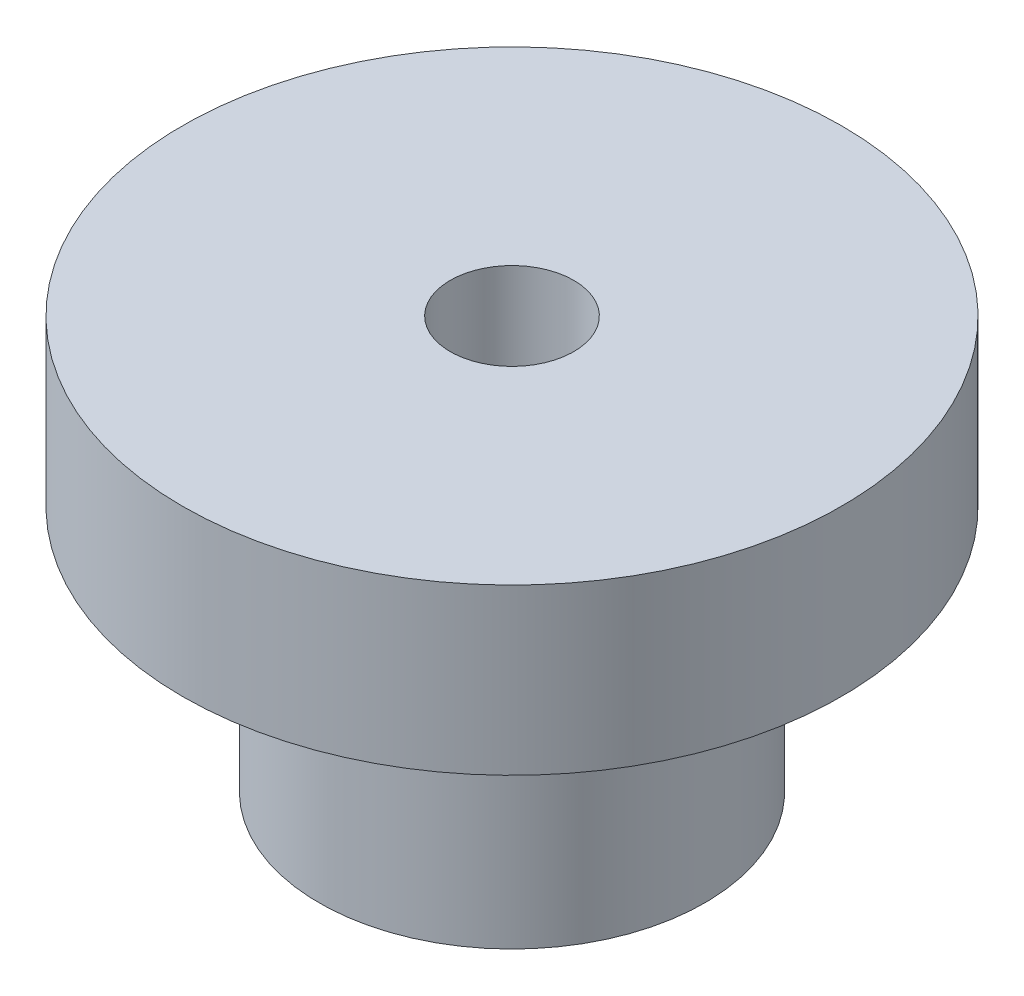
ISO-10303-21;
HEADER;
FILE_DESCRIPTION(('STEP AP214'),'2;1');
FILE_NAME('part.step','',(''),(''),'','','');
FILE_SCHEMA(('AUTOMOTIVE_DESIGN { 1 0 10303 214 1 1 1 1 }'));
ENDSEC;
DATA;
#1=APPLICATION_CONTEXT('core data for automotive mechanical design processes');
#2=APPLICATION_PROTOCOL_DEFINITION('international standard','automotive_design',2000,#1);
#3=PRODUCT_CONTEXT('',#1,'mechanical');
#4=PRODUCT('Part','Part','',(#3));
#5=PRODUCT_RELATED_PRODUCT_CATEGORY('part','',(#4));
#6=PRODUCT_DEFINITION_FORMATION('','',#4);
#7=PRODUCT_DEFINITION_CONTEXT('part definition',#1,'design');
#8=PRODUCT_DEFINITION('design','',#6,#7);
#9=PRODUCT_DEFINITION_SHAPE('','',#8);
#10=(LENGTH_UNIT() NAMED_UNIT(*) SI_UNIT(.MILLI.,.METRE.));
#11=(NAMED_UNIT(*) PLANE_ANGLE_UNIT() SI_UNIT($,.RADIAN.));
#12=(NAMED_UNIT(*) SI_UNIT($,.STERADIAN.) SOLID_ANGLE_UNIT());
#13=UNCERTAINTY_MEASURE_WITH_UNIT(LENGTH_MEASURE(1.E-05),#10,'distance_accuracy_value','');
#14=(GEOMETRIC_REPRESENTATION_CONTEXT(3) GLOBAL_UNCERTAINTY_ASSIGNED_CONTEXT((#13)) GLOBAL_UNIT_ASSIGNED_CONTEXT((#10,
#11,#12)) REPRESENTATION_CONTEXT('',''));
#15=CARTESIAN_POINT('',(0.,0.,0.));
#16=DIRECTION('',(0.,0.,1.));
#17=DIRECTION('',(1.,0.,0.));
#18=AXIS2_PLACEMENT_3D('',#15,#16,#17);
#19=CARTESIAN_POINT('',(-27.1992051574368,0.,0.));
#20=DIRECTION('',(0.,1.,0.));
#21=DIRECTION('',(0.,0.,1.));
#22=AXIS2_PLACEMENT_3D('',#19,#20,#21);
#23=PLANE('',#22);
#24=CARTESIAN_POINT('',(-27.1992051574368,0.,0.));
#25=DIRECTION('',(0.,1.,0.));
#26=DIRECTION('',(0.,0.,1.));
#27=AXIS2_PLACEMENT_3D('',#24,#25,#26);
#28=CIRCLE('',#27,3.71475);
#29=CARTESIAN_POINT('',(-27.1992051574368,0.,-3.71475));
#30=VERTEX_POINT('',#29);
#31=EDGE_CURVE('E38',#30,#30,#28,.T.);
#32=ORIENTED_EDGE('',*,*,#31,.F.);
#33=EDGE_LOOP('',(#32));
#34=FACE_BOUND('',#33,.T.);
#35=CARTESIAN_POINT('',(-27.1992051574368,0.,0.));
#36=DIRECTION('',(0.,1.,0.));
#37=DIRECTION('',(0.,0.,1.));
#38=AXIS2_PLACEMENT_3D('',#35,#36,#37);
#39=CIRCLE('',#38,1.190625);
#40=CARTESIAN_POINT('',(-27.1992051574368,0.,-1.190625));
#41=VERTEX_POINT('',#40);
#42=EDGE_CURVE('E45',#41,#41,#39,.T.);
#43=ORIENTED_EDGE('',*,*,#42,.T.);
#44=EDGE_LOOP('',(#43));
#45=FACE_BOUND('',#44,.T.);
#46=ADVANCED_FACE('F34',(#34,#45),#23,.F.);
#47=CARTESIAN_POINT('',(-27.1992051574368,4.7625,0.));
#48=DIRECTION('',(0.,-1.,0.));
#49=DIRECTION('',(0.,0.,-1.));
#50=AXIS2_PLACEMENT_3D('',#47,#48,#49);
#51=CYLINDRICAL_SURFACE('',#50,3.71475);
#52=CARTESIAN_POINT('',(-27.1992051574368,4.7625,0.));
#53=DIRECTION('',(0.,1.,0.));
#54=DIRECTION('',(0.,0.,1.));
#55=AXIS2_PLACEMENT_3D('',#52,#53,#54);
#56=CIRCLE('',#55,3.71475);
#57=CARTESIAN_POINT('',(-27.1992051574368,4.7625,-3.71475));
#58=VERTEX_POINT('',#57);
#59=EDGE_CURVE('E10',#58,#58,#56,.T.);
#60=CARTESIAN_POINT('',(-27.1992051574368,4.7625,-3.71475));
#61=CARTESIAN_POINT('',(-27.1992051574368,4.712890625,-3.71475));
#62=CARTESIAN_POINT('',(-27.1992051574368,4.66328125,-3.71475));
#63=CARTESIAN_POINT('',(-27.1992051574368,4.5640625,-3.71475));
#64=CARTESIAN_POINT('',(-27.1992051574368,4.514453125,-3.71475));
#65=CARTESIAN_POINT('',(-27.1992051574368,4.415234375,-3.71475));
#66=CARTESIAN_POINT('',(-27.1992051574368,4.365625,-3.71475));
#67=CARTESIAN_POINT('',(-27.1992051574368,4.26640625,-3.71475));
#68=CARTESIAN_POINT('',(-27.1992051574368,4.216796875,-3.71475));
#69=CARTESIAN_POINT('',(-27.1992051574368,4.117578125,-3.71475));
#70=CARTESIAN_POINT('',(-27.1992051574368,4.06796875,-3.71475));
#71=CARTESIAN_POINT('',(-27.1992051574368,3.96875,-3.71475));
#72=CARTESIAN_POINT('',(-27.1992051574368,3.919140625,-3.71475));
#73=CARTESIAN_POINT('',(-27.1992051574368,3.819921875,-3.71475));
#74=CARTESIAN_POINT('',(-27.1992051574368,3.7703125,-3.71475));
#75=CARTESIAN_POINT('',(-27.1992051574368,3.67109375,-3.71475));
#76=CARTESIAN_POINT('',(-27.1992051574368,3.621484375,-3.71475));
#77=CARTESIAN_POINT('',(-27.1992051574368,3.522265625,-3.71475));
#78=CARTESIAN_POINT('',(-27.1992051574368,3.47265625,-3.71475));
#79=CARTESIAN_POINT('',(-27.1992051574368,3.3734375,-3.71475));
#80=CARTESIAN_POINT('',(-27.1992051574368,3.323828125,-3.71475));
#81=CARTESIAN_POINT('',(-27.1992051574368,3.224609375,-3.71475));
#82=CARTESIAN_POINT('',(-27.1992051574368,3.175,-3.71475));
#83=CARTESIAN_POINT('',(-27.1992051574368,3.07578125,-3.71475));
#84=CARTESIAN_POINT('',(-27.1992051574368,3.026171875,-3.71475));
#85=CARTESIAN_POINT('',(-27.1992051574368,2.926953125,-3.71475));
#86=CARTESIAN_POINT('',(-27.1992051574368,2.87734375,-3.71475));
#87=CARTESIAN_POINT('',(-27.1992051574368,2.778125,-3.71475));
#88=CARTESIAN_POINT('',(-27.1992051574368,2.728515625,-3.71475));
#89=CARTESIAN_POINT('',(-27.1992051574368,2.629296875,-3.71475));
#90=CARTESIAN_POINT('',(-27.1992051574368,2.5796875,-3.71475));
#91=CARTESIAN_POINT('',(-27.1992051574368,2.48046875,-3.71475));
#92=CARTESIAN_POINT('',(-27.1992051574368,2.430859375,-3.71475));
#93=CARTESIAN_POINT('',(-27.1992051574368,2.331640625,-3.71475));
#94=CARTESIAN_POINT('',(-27.1992051574368,2.28203125,-3.71475));
#95=CARTESIAN_POINT('',(-27.1992051574368,2.1828125,-3.71475));
#96=CARTESIAN_POINT('',(-27.1992051574368,2.133203125,-3.71475));
#97=CARTESIAN_POINT('',(-27.1992051574368,2.033984375,-3.71475));
#98=CARTESIAN_POINT('',(-27.1992051574368,1.984375,-3.71475));
#99=CARTESIAN_POINT('',(-27.1992051574368,1.88515625,-3.71475));
#100=CARTESIAN_POINT('',(-27.1992051574368,1.835546875,-3.71475));
#101=CARTESIAN_POINT('',(-27.1992051574368,1.736328125,-3.71475));
#102=CARTESIAN_POINT('',(-27.1992051574368,1.68671875,-3.71475));
#103=CARTESIAN_POINT('',(-27.1992051574368,1.5875,-3.71475));
#104=CARTESIAN_POINT('',(-27.1992051574368,1.537890625,-3.71475));
#105=CARTESIAN_POINT('',(-27.1992051574368,1.438671875,-3.71475));
#106=CARTESIAN_POINT('',(-27.1992051574368,1.3890625,-3.71475));
#107=CARTESIAN_POINT('',(-27.1992051574368,1.28984375,-3.71475));
#108=CARTESIAN_POINT('',(-27.1992051574368,1.240234375,-3.71475));
#109=CARTESIAN_POINT('',(-27.1992051574368,1.141015625,-3.71475));
#110=CARTESIAN_POINT('',(-27.1992051574368,1.09140625,-3.71475));
#111=CARTESIAN_POINT('',(-27.1992051574368,0.9921875,-3.71475));
#112=CARTESIAN_POINT('',(-27.1992051574368,0.942578125,-3.71475));
#113=CARTESIAN_POINT('',(-27.1992051574368,0.843359375,-3.71475));
#114=CARTESIAN_POINT('',(-27.1992051574368,0.79375,-3.71475));
#115=CARTESIAN_POINT('',(-27.1992051574368,0.69453125,-3.71475));
#116=CARTESIAN_POINT('',(-27.1992051574368,0.644921875,-3.71475));
#117=CARTESIAN_POINT('',(-27.1992051574368,0.545703125,-3.71475));
#118=CARTESIAN_POINT('',(-27.1992051574368,0.49609375,-3.71475));
#119=CARTESIAN_POINT('',(-27.1992051574368,0.396875,-3.71475));
#120=CARTESIAN_POINT('',(-27.1992051574368,0.347265625,-3.71475));
#121=CARTESIAN_POINT('',(-27.1992051574368,0.248046875,-3.71475));
#122=CARTESIAN_POINT('',(-27.1992051574368,0.1984375,-3.71475));
#123=CARTESIAN_POINT('',(-27.1992051574368,0.09921875,-3.71475));
#124=CARTESIAN_POINT('',(-27.1992051574368,0.049609375,-3.71475));
#125=CARTESIAN_POINT('',(-27.1992051574368,0.,-3.71475));
#126=B_SPLINE_CURVE_WITH_KNOTS('',3,(#60,#61,#62,#63,#64,#65,#66,#67,#68,#69,#70,#71,#72,#73,
#74,#75,#76,#77,#78,#79,#80,#81,#82,#83,#84,#85,#86,#87,#88,#89,#90,#91,#92,#93,#94,#95,#96,#97,
#98,#99,#100,#101,#102,#103,#104,#105,#106,#107,#108,#109,#110,#111,#112,#113,#114,#115,#116,
#117,#118,#119,#120,#121,#122,#123,#124,#125),.UNSPECIFIED.,.F.,.F.,(4,2,2,2,2,2,2,2,2,2,2,2,2,
2,2,2,2,2,2,2,2,2,2,2,2,2,2,2,2,2,2,2,4),(0.,0.148828124999999,0.297656249999999,
0.446484374999999,0.595312499999999,0.744140625,0.89296875,1.041796875,1.190625,1.339453125,
1.48828125,1.637109375,1.7859375,1.934765625,2.08359375,2.232421875,2.38125,2.530078125,
2.67890625,2.827734375,2.9765625,3.125390625,3.27421875,3.423046875,3.571875,3.720703125,
3.86953125,4.018359375,4.1671875,4.316015625,4.46484375,4.613671875,4.7625),.UNSPECIFIED.);
#127=EDGE_CURVE('BSEAM36',#58,#30,#126,.T.);
#128=ORIENTED_EDGE('',*,*,#59,.F.);
#129=ORIENTED_EDGE('',*,*,#31,.T.);
#130=ORIENTED_EDGE('',*,*,#127,.T.);
#131=ORIENTED_EDGE('',*,*,#127,.F.);
#132=EDGE_LOOP('',(#128,#130,#129,#131));
#133=FACE_BOUND('',#132,.T.);
#134=ADVANCED_FACE('F36',(#133),#51,.T.);
#135=CARTESIAN_POINT('',(-27.1992051574368,4.7625,0.));
#136=DIRECTION('',(0.,-1.,0.));
#137=DIRECTION('',(0.,0.,-1.));
#138=AXIS2_PLACEMENT_3D('',#135,#136,#137);
#139=CYLINDRICAL_SURFACE('',#138,1.190625);
#140=CARTESIAN_POINT('',(-27.1992051574368,7.9375,0.));
#141=DIRECTION('',(0.,1.,0.));
#142=DIRECTION('',(0.,0.,1.));
#143=AXIS2_PLACEMENT_3D('',#140,#141,#142);
#144=CIRCLE('',#143,1.190625);
#145=CARTESIAN_POINT('',(-27.1992051574368,7.9375,-1.190625));
#146=VERTEX_POINT('',#145);
#147=EDGE_CURVE('E53',#146,#146,#144,.T.);
#148=CARTESIAN_POINT('',(-27.1992051574368,0.,-1.190625));
#149=CARTESIAN_POINT('',(-27.1992051574368,0.0826822916666666,-1.190625));
#150=CARTESIAN_POINT('',(-27.1992051574368,0.165364583333333,-1.190625));
#151=CARTESIAN_POINT('',(-27.1992051574368,0.330729166666666,-1.190625));
#152=CARTESIAN_POINT('',(-27.1992051574368,0.413411458333333,-1.190625));
#153=CARTESIAN_POINT('',(-27.1992051574368,0.578776041666667,-1.190625));
#154=CARTESIAN_POINT('',(-27.1992051574368,0.661458333333334,-1.190625));
#155=CARTESIAN_POINT('',(-27.1992051574368,0.826822916666667,-1.190625));
#156=CARTESIAN_POINT('',(-27.1992051574368,0.909505208333333,-1.190625));
#157=CARTESIAN_POINT('',(-27.1992051574368,1.07486979166667,-1.190625));
#158=CARTESIAN_POINT('',(-27.1992051574368,1.15755208333333,-1.190625));
#159=CARTESIAN_POINT('',(-27.1992051574368,1.32291666666667,-1.190625));
#160=CARTESIAN_POINT('',(-27.1992051574368,1.40559895833333,-1.190625));
#161=CARTESIAN_POINT('',(-27.1992051574368,1.57096354166667,-1.190625));
#162=CARTESIAN_POINT('',(-27.1992051574368,1.65364583333333,-1.190625));
#163=CARTESIAN_POINT('',(-27.1992051574368,1.81901041666667,-1.190625));
#164=CARTESIAN_POINT('',(-27.1992051574368,1.90169270833333,-1.190625));
#165=CARTESIAN_POINT('',(-27.1992051574368,2.06705729166667,-1.190625));
#166=CARTESIAN_POINT('',(-27.1992051574368,2.14973958333333,-1.190625));
#167=CARTESIAN_POINT('',(-27.1992051574368,2.31510416666667,-1.190625));
#168=CARTESIAN_POINT('',(-27.1992051574368,2.39778645833333,-1.190625));
#169=CARTESIAN_POINT('',(-27.1992051574368,2.56315104166667,-1.190625));
#170=CARTESIAN_POINT('',(-27.1992051574368,2.64583333333333,-1.190625));
#171=CARTESIAN_POINT('',(-27.1992051574368,2.81119791666667,-1.190625));
#172=CARTESIAN_POINT('',(-27.1992051574368,2.89388020833333,-1.190625));
#173=CARTESIAN_POINT('',(-27.1992051574368,3.05924479166667,-1.190625));
#174=CARTESIAN_POINT('',(-27.1992051574368,3.14192708333333,-1.190625));
#175=CARTESIAN_POINT('',(-27.1992051574368,3.30729166666667,-1.190625));
#176=CARTESIAN_POINT('',(-27.1992051574368,3.38997395833333,-1.190625));
#177=CARTESIAN_POINT('',(-27.1992051574368,3.55533854166667,-1.190625));
#178=CARTESIAN_POINT('',(-27.1992051574368,3.63802083333333,-1.190625));
#179=CARTESIAN_POINT('',(-27.1992051574368,3.80338541666667,-1.190625));
#180=CARTESIAN_POINT('',(-27.1992051574368,3.88606770833333,-1.190625));
#181=CARTESIAN_POINT('',(-27.1992051574368,4.05143229166667,-1.190625));
#182=CARTESIAN_POINT('',(-27.1992051574368,4.13411458333333,-1.190625));
#183=CARTESIAN_POINT('',(-27.1992051574368,4.29947916666667,-1.190625));
#184=CARTESIAN_POINT('',(-27.1992051574368,4.38216145833333,-1.190625));
#185=CARTESIAN_POINT('',(-27.1992051574368,4.54752604166667,-1.190625));
#186=CARTESIAN_POINT('',(-27.1992051574368,4.63020833333333,-1.190625));
#187=CARTESIAN_POINT('',(-27.1992051574368,4.79557291666667,-1.190625));
#188=CARTESIAN_POINT('',(-27.1992051574368,4.87825520833333,-1.190625));
#189=CARTESIAN_POINT('',(-27.1992051574368,5.04361979166667,-1.190625));
#190=CARTESIAN_POINT('',(-27.1992051574368,5.12630208333333,-1.190625));
#191=CARTESIAN_POINT('',(-27.1992051574368,5.29166666666667,-1.190625));
#192=CARTESIAN_POINT('',(-27.1992051574368,5.37434895833333,-1.190625));
#193=CARTESIAN_POINT('',(-27.1992051574368,5.53971354166667,-1.190625));
#194=CARTESIAN_POINT('',(-27.1992051574368,5.62239583333333,-1.190625));
#195=CARTESIAN_POINT('',(-27.1992051574368,5.78776041666667,-1.190625));
#196=CARTESIAN_POINT('',(-27.1992051574368,5.87044270833333,-1.190625));
#197=CARTESIAN_POINT('',(-27.1992051574368,6.03580729166667,-1.190625));
#198=CARTESIAN_POINT('',(-27.1992051574368,6.11848958333333,-1.190625));
#199=CARTESIAN_POINT('',(-27.1992051574368,6.28385416666667,-1.190625));
#200=CARTESIAN_POINT('',(-27.1992051574368,6.36653645833333,-1.190625));
#201=CARTESIAN_POINT('',(-27.1992051574368,6.53190104166667,-1.190625));
#202=CARTESIAN_POINT('',(-27.1992051574368,6.61458333333333,-1.190625));
#203=CARTESIAN_POINT('',(-27.1992051574368,6.77994791666667,-1.190625));
#204=CARTESIAN_POINT('',(-27.1992051574368,6.86263020833333,-1.190625));
#205=CARTESIAN_POINT('',(-27.1992051574368,7.02799479166666,-1.190625));
#206=CARTESIAN_POINT('',(-27.1992051574368,7.11067708333333,-1.190625));
#207=CARTESIAN_POINT('',(-27.1992051574368,7.27604166666667,-1.190625));
#208=CARTESIAN_POINT('',(-27.1992051574368,7.35872395833333,-1.190625));
#209=CARTESIAN_POINT('',(-27.1992051574368,7.52408854166667,-1.190625));
#210=CARTESIAN_POINT('',(-27.1992051574368,7.60677083333333,-1.190625));
#211=CARTESIAN_POINT('',(-27.1992051574368,7.77213541666667,-1.190625));
#212=CARTESIAN_POINT('',(-27.1992051574368,7.85481770833333,-1.190625));
#213=CARTESIAN_POINT('',(-27.1992051574368,7.9375,-1.190625));
#214=B_SPLINE_CURVE_WITH_KNOTS('',3,(#148,#149,#150,#151,#152,#153,#154,#155,#156,#157,#158,
#159,#160,#161,#162,#163,#164,#165,#166,#167,#168,#169,#170,#171,#172,#173,#174,#175,#176,#177,
#178,#179,#180,#181,#182,#183,#184,#185,#186,#187,#188,#189,#190,#191,#192,#193,#194,#195,#196,
#197,#198,#199,#200,#201,#202,#203,#204,#205,#206,#207,#208,#209,#210,#211,#212,#213),
.UNSPECIFIED.,.F.,.F.,(4,2,2,2,2,2,2,2,2,2,2,2,2,2,2,2,2,2,2,2,2,2,2,2,2,2,2,2,2,2,2,2,4),(0.,
0.248046875,0.49609375,0.744140625,0.9921875,1.240234375,1.48828125,1.736328125,1.984375,
2.232421875,2.48046875,2.728515625,2.9765625,3.224609375,3.47265625,3.720703125,3.96875,
4.216796875,4.46484375,4.712890625,4.9609375,5.208984375,5.45703125,5.705078125,5.953125,
6.201171875,6.44921875,6.697265625,6.9453125,7.193359375,7.44140625,7.689453125,7.9375),.UNSPECIFIED.);
#215=EDGE_CURVE('BSEAM59',#41,#146,#214,.T.);
#216=ORIENTED_EDGE('',*,*,#42,.F.);
#217=ORIENTED_EDGE('',*,*,#147,.T.);
#218=ORIENTED_EDGE('',*,*,#215,.T.);
#219=ORIENTED_EDGE('',*,*,#215,.F.);
#220=EDGE_LOOP('',(#216,#218,#217,#219));
#221=FACE_BOUND('',#220,.T.);
#222=ADVANCED_FACE('F59',(#221),#139,.F.);
#223=CARTESIAN_POINT('',(-27.1992051574368,7.9375,0.));
#224=DIRECTION('',(0.,1.,0.));
#225=DIRECTION('',(0.,0.,1.));
#226=AXIS2_PLACEMENT_3D('',#223,#224,#225);
#227=PLANE('',#226);
#228=CARTESIAN_POINT('',(-27.1992051574368,7.9375,0.));
#229=DIRECTION('',(0.,1.,0.));
#230=DIRECTION('',(0.,0.,1.));
#231=AXIS2_PLACEMENT_3D('',#228,#229,#230);
#232=CIRCLE('',#231,6.35);
#233=CARTESIAN_POINT('',(-27.1992051574368,7.9375,6.35));
#234=VERTEX_POINT('',#233);
#235=EDGE_CURVE('E49',#234,#234,#232,.T.);
#236=ORIENTED_EDGE('',*,*,#235,.T.);
#237=EDGE_LOOP('',(#236));
#238=FACE_BOUND('',#237,.T.);
#239=ORIENTED_EDGE('',*,*,#147,.F.);
#240=EDGE_LOOP('',(#239));
#241=FACE_BOUND('',#240,.T.);
#242=ADVANCED_FACE('F61',(#238,#241),#227,.T.);
#243=CARTESIAN_POINT('',(-27.1992051574368,4.7625,0.));
#244=DIRECTION('',(0.,1.,0.));
#245=DIRECTION('',(0.,0.,1.));
#246=AXIS2_PLACEMENT_3D('',#243,#244,#245);
#247=PLANE('',#246);
#248=ORIENTED_EDGE('',*,*,#59,.T.);
#249=EDGE_LOOP('',(#248));
#250=FACE_BOUND('',#249,.T.);
#251=CARTESIAN_POINT('',(-27.1992051574368,4.7625,0.));
#252=DIRECTION('',(0.,1.,0.));
#253=DIRECTION('',(0.,0.,1.));
#254=AXIS2_PLACEMENT_3D('',#251,#252,#253);
#255=CIRCLE('',#254,6.35);
#256=CARTESIAN_POINT('',(-27.1992051574368,4.7625,6.35));
#257=VERTEX_POINT('',#256);
#258=EDGE_CURVE('E50',#257,#257,#255,.T.);
#259=ORIENTED_EDGE('',*,*,#258,.F.);
#260=EDGE_LOOP('',(#259));
#261=FACE_BOUND('',#260,.T.);
#262=ADVANCED_FACE('F63',(#250,#261),#247,.F.);
#263=CARTESIAN_POINT('',(-27.1992051574368,7.9375,0.));
#264=DIRECTION('',(0.,-1.,0.));
#265=DIRECTION('',(0.,0.,-1.));
#266=AXIS2_PLACEMENT_3D('',#263,#264,#265);
#267=CYLINDRICAL_SURFACE('',#266,6.35);
#268=ORIENTED_EDGE('',*,*,#235,.F.);
#269=EDGE_LOOP('',(#268));
#270=FACE_BOUND('',#269,.T.);
#271=ORIENTED_EDGE('',*,*,#258,.T.);
#272=EDGE_LOOP('',(#271));
#273=FACE_BOUND('',#272,.T.);
#274=ADVANCED_FACE('F70',(#270,#273),#267,.T.);
#275=CLOSED_SHELL('',(#46,#134,#222,#242,#262,#274));
#276=MANIFOLD_SOLID_BREP('B2',#275);
#277=ADVANCED_BREP_SHAPE_REPRESENTATION('',(#18,#276),#14);
#278=SHAPE_DEFINITION_REPRESENTATION(#9,#277);
ENDSEC;
END-ISO-10303-21;
